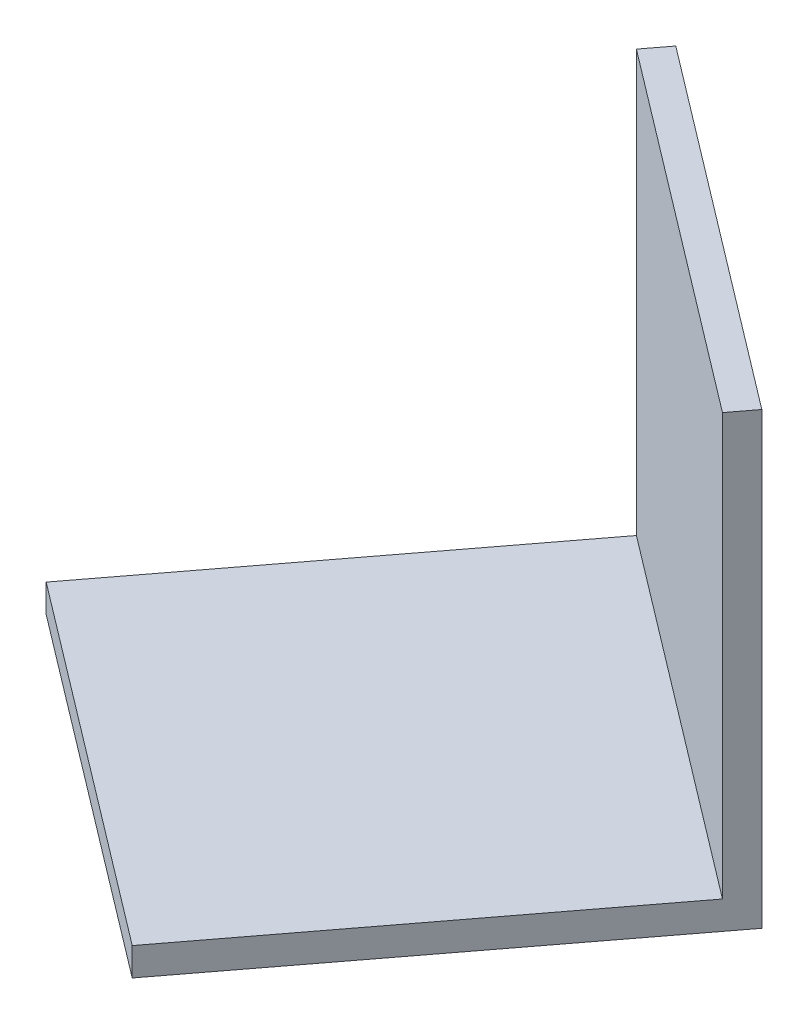
ISO-10303-21;
HEADER;
FILE_DESCRIPTION(('STEP AP214'),'2;1');
FILE_NAME('part.step','',(''),(''),'','','');
FILE_SCHEMA(('AUTOMOTIVE_DESIGN { 1 0 10303 214 1 1 1 1 }'));
ENDSEC;
DATA;
#1=APPLICATION_CONTEXT('core data for automotive mechanical design processes');
#2=APPLICATION_PROTOCOL_DEFINITION('international standard','automotive_design',2000,#1);
#3=PRODUCT_CONTEXT('',#1,'mechanical');
#4=PRODUCT('Part','Part','',(#3));
#5=PRODUCT_RELATED_PRODUCT_CATEGORY('part','',(#4));
#6=PRODUCT_DEFINITION_FORMATION('','',#4);
#7=PRODUCT_DEFINITION_CONTEXT('part definition',#1,'design');
#8=PRODUCT_DEFINITION('design','',#6,#7);
#9=PRODUCT_DEFINITION_SHAPE('','',#8);
#10=(LENGTH_UNIT() NAMED_UNIT(*) SI_UNIT(.MILLI.,.METRE.));
#11=(NAMED_UNIT(*) PLANE_ANGLE_UNIT() SI_UNIT($,.RADIAN.));
#12=(NAMED_UNIT(*) SI_UNIT($,.STERADIAN.) SOLID_ANGLE_UNIT());
#13=UNCERTAINTY_MEASURE_WITH_UNIT(LENGTH_MEASURE(1.E-05),#10,'distance_accuracy_value','');
#14=(GEOMETRIC_REPRESENTATION_CONTEXT(3) GLOBAL_UNCERTAINTY_ASSIGNED_CONTEXT((#13)) GLOBAL_UNIT_ASSIGNED_CONTEXT((#10,
#11,#12)) REPRESENTATION_CONTEXT('',''));
#15=CARTESIAN_POINT('',(0.,0.,0.));
#16=DIRECTION('',(0.,0.,1.));
#17=DIRECTION('',(1.,0.,0.));
#18=AXIS2_PLACEMENT_3D('',#15,#16,#17);
#19=CARTESIAN_POINT('',(0.,1.5875,0.));
#20=DIRECTION('',(0.,-1.,0.));
#21=DIRECTION('',(0.,0.,-1.));
#22=AXIS2_PLACEMENT_3D('',#19,#20,#21);
#23=PLANE('',#22);
#24=DIRECTION('',(0.796356247548099,0.,0.604827849053854));
#25=VECTOR('',#24,1.);
#26=CARTESIAN_POINT('',(-5.82498553212682,1.5875,-34.325860510707));
#27=LINE('',#26,#25);
#28=CARTESIAN_POINT('',(-5.82498553212682,1.5875,-34.325860510707));
#29=VERTEX_POINT('',#28);
#30=CARTESIAN_POINT('',(14.4024631555949,1.5875,-18.9632331447391));
#31=VERTEX_POINT('',#30);
#32=EDGE_CURVE('E50',#29,#31,#27,.T.);
#33=ORIENTED_EDGE('',*,*,#32,.F.);
#34=DIRECTION('',(-0.604827849053854,0.,0.796356247548099));
#35=VECTOR('',#34,1.);
#36=CARTESIAN_POINT('',(-20.2274486877217,1.5875,-15.3626273659679));
#37=LINE('',#36,#35);
#38=CARTESIAN_POINT('',(-20.2274486877217,1.5875,-15.3626273659679));
#39=VERTEX_POINT('',#38);
#40=EDGE_CURVE('E55',#29,#39,#37,.T.);
#41=ORIENTED_EDGE('',*,*,#40,.T.);
#42=DIRECTION('',(0.796356247548099,0.,0.604827849053854));
#43=VECTOR('',#42,1.);
#44=CARTESIAN_POINT('',(0.,1.5875,0.));
#45=LINE('',#44,#43);
#46=CARTESIAN_POINT('',(0.,1.5875,0.));
#47=VERTEX_POINT('',#46);
#48=EDGE_CURVE('E86',#39,#47,#45,.T.);
#49=ORIENTED_EDGE('',*,*,#48,.T.);
#50=DIRECTION('',(0.604827849053854,0.,-0.796356247548099));
#51=VECTOR('',#50,1.);
#52=CARTESIAN_POINT('',(0.,1.5875,0.));
#53=LINE('',#52,#51);
#54=EDGE_CURVE('E136',#47,#31,#53,.T.);
#55=ORIENTED_EDGE('',*,*,#54,.T.);
#56=EDGE_LOOP('',(#33,#41,#49,#55));
#57=FACE_BOUND('',#56,.T.);
#58=ADVANCED_FACE('F35',(#57),#23,.F.);
#59=CARTESIAN_POINT('',(0.,1.5875,0.));
#60=DIRECTION('',(0.604827849053854,0.,-0.796356247548099));
#61=DIRECTION('',(-0.796356247548099,0.,-0.604827849053854));
#62=AXIS2_PLACEMENT_3D('',#59,#60,#61);
#63=PLANE('',#62);
#64=DIRECTION('',(0.796356247548099,0.,0.604827849053854));
#65=VECTOR('',#64,1.);
#66=CARTESIAN_POINT('',(0.,0.,0.));
#67=LINE('',#66,#65);
#68=CARTESIAN_POINT('',(-20.2274486877217,0.,-15.3626273659679));
#69=VERTEX_POINT('',#68);
#70=CARTESIAN_POINT('',(0.,0.,0.));
#71=VERTEX_POINT('',#70);
#72=EDGE_CURVE('E92',#69,#71,#67,.T.);
#73=ORIENTED_EDGE('',*,*,#72,.T.);
#74=DIRECTION('',(0.,-1.,0.));
#75=VECTOR('',#74,1.);
#76=CARTESIAN_POINT('',(0.,1.5875,0.));
#77=LINE('',#76,#75);
#78=EDGE_CURVE('E11',#47,#71,#77,.T.);
#79=ORIENTED_EDGE('',*,*,#78,.F.);
#80=ORIENTED_EDGE('',*,*,#48,.F.);
#81=DIRECTION('',(0.,-1.,0.));
#82=VECTOR('',#81,1.);
#83=CARTESIAN_POINT('',(-20.2274486877217,1.5875,-15.3626273659679));
#84=LINE('',#83,#82);
#85=EDGE_CURVE('E78',#39,#69,#84,.T.);
#86=ORIENTED_EDGE('',*,*,#85,.T.);
#87=EDGE_LOOP('',(#73,#79,#80,#86));
#88=FACE_BOUND('',#87,.T.);
#89=ADVANCED_FACE('F37',(#88),#63,.F.);
#90=CARTESIAN_POINT('',(0.,1.5875,0.));
#91=DIRECTION('',(-0.796356247548099,0.,-0.604827849053854));
#92=DIRECTION('',(-0.604827849053854,0.,0.796356247548099));
#93=AXIS2_PLACEMENT_3D('',#90,#91,#92);
#94=PLANE('',#93);
#95=DIRECTION('',(0.604827849053854,0.,-0.796356247548099));
#96=VECTOR('',#95,1.);
#97=CARTESIAN_POINT('',(0.,0.,0.));
#98=LINE('',#97,#96);
#99=CARTESIAN_POINT('',(15.3626273659679,0.,-20.2274486877217));
#100=VERTEX_POINT('',#99);
#101=EDGE_CURVE('E95',#71,#100,#98,.T.);
#102=ORIENTED_EDGE('',*,*,#101,.T.);
#103=DIRECTION('',(0.,-1.,0.));
#104=VECTOR('',#103,1.);
#105=CARTESIAN_POINT('',(15.3626273659679,1.5875,-20.2274486877217));
#106=LINE('',#105,#104);
#107=CARTESIAN_POINT('',(15.3626273659679,25.4,-20.2274486877217));
#108=VERTEX_POINT('',#107);
#109=EDGE_CURVE('E43',#108,#100,#106,.T.);
#110=ORIENTED_EDGE('',*,*,#109,.F.);
#111=DIRECTION('',(0.604827849053851,0.,-0.796356247548101));
#112=VECTOR('',#111,1.);
#113=CARTESIAN_POINT('',(15.3626273659679,25.4,-20.2274486877217));
#114=LINE('',#113,#112);
#115=CARTESIAN_POINT('',(14.4024631555949,25.4,-18.9632331447391));
#116=VERTEX_POINT('',#115);
#117=EDGE_CURVE('E119',#116,#108,#114,.T.);
#118=ORIENTED_EDGE('',*,*,#117,.F.);
#119=DIRECTION('',(0.,-1.,0.));
#120=VECTOR('',#119,1.);
#121=CARTESIAN_POINT('',(14.4024631555949,25.4,-18.9632331447391));
#122=LINE('',#121,#120);
#123=EDGE_CURVE('E100',#116,#31,#122,.T.);
#124=ORIENTED_EDGE('',*,*,#123,.T.);
#125=ORIENTED_EDGE('',*,*,#54,.F.);
#126=ORIENTED_EDGE('',*,*,#78,.T.);
#127=EDGE_LOOP('',(#102,#110,#118,#124,#125,#126));
#128=FACE_BOUND('',#127,.T.);
#129=ADVANCED_FACE('F116',(#128),#94,.F.);
#130=CARTESIAN_POINT('',(15.3626273659679,1.5875,-20.2274486877217));
#131=DIRECTION('',(-0.604827849053853,0.,0.796356247548099));
#132=DIRECTION('',(0.796356247548099,0.,0.604827849053853));
#133=AXIS2_PLACEMENT_3D('',#130,#131,#132);
#134=PLANE('',#133);
#135=DIRECTION('',(-0.796356247548099,0.,-0.604827849053853));
#136=VECTOR('',#135,1.);
#137=CARTESIAN_POINT('',(15.3626273659679,0.,-20.2274486877217));
#138=LINE('',#137,#136);
#139=CARTESIAN_POINT('',(-4.86482132175382,0.,-35.5900760536896));
#140=VERTEX_POINT('',#139);
#141=EDGE_CURVE('E87',#100,#140,#138,.T.);
#142=ORIENTED_EDGE('',*,*,#141,.T.);
#143=DIRECTION('',(0.,-1.,0.));
#144=VECTOR('',#143,1.);
#145=CARTESIAN_POINT('',(-4.86482132175382,1.5875,-35.5900760536896));
#146=LINE('',#145,#144);
#147=CARTESIAN_POINT('',(-4.86482132175382,25.4,-35.5900760536896));
#148=VERTEX_POINT('',#147);
#149=EDGE_CURVE('E82',#148,#140,#146,.T.);
#150=ORIENTED_EDGE('',*,*,#149,.F.);
#151=DIRECTION('',(-0.796356247548099,0.,-0.604827849053854));
#152=VECTOR('',#151,1.);
#153=CARTESIAN_POINT('',(-4.86482132175382,25.4,-35.5900760536896));
#154=LINE('',#153,#152);
#155=EDGE_CURVE('E112',#108,#148,#154,.T.);
#156=ORIENTED_EDGE('',*,*,#155,.F.);
#157=ORIENTED_EDGE('',*,*,#109,.T.);
#158=EDGE_LOOP('',(#142,#150,#156,#157));
#159=FACE_BOUND('',#158,.T.);
#160=ADVANCED_FACE('F110',(#159),#134,.F.);
#161=CARTESIAN_POINT('',(-20.2274486877217,1.5875,-15.3626273659679));
#162=DIRECTION('',(0.796356247548099,0.,0.604827849053854));
#163=DIRECTION('',(0.604827849053854,0.,-0.796356247548099));
#164=AXIS2_PLACEMENT_3D('',#161,#162,#163);
#165=PLANE('',#164);
#166=DIRECTION('',(-0.604827849053854,0.,0.796356247548099));
#167=VECTOR('',#166,1.);
#168=CARTESIAN_POINT('',(-20.2274486877217,0.,-15.3626273659679));
#169=LINE('',#168,#167);
#170=EDGE_CURVE('E75',#140,#69,#169,.T.);
#171=ORIENTED_EDGE('',*,*,#170,.T.);
#172=ORIENTED_EDGE('',*,*,#85,.F.);
#173=ORIENTED_EDGE('',*,*,#40,.F.);
#174=DIRECTION('',(0.,-1.,0.));
#175=VECTOR('',#174,1.);
#176=CARTESIAN_POINT('',(-5.82498553212682,25.4,-34.325860510707));
#177=LINE('',#176,#175);
#178=CARTESIAN_POINT('',(-5.82498553212682,25.4,-34.325860510707));
#179=VERTEX_POINT('',#178);
#180=EDGE_CURVE('E96',#179,#29,#177,.T.);
#181=ORIENTED_EDGE('',*,*,#180,.F.);
#182=DIRECTION('',(-0.604827849053853,0.,0.796356247548099));
#183=VECTOR('',#182,1.);
#184=CARTESIAN_POINT('',(-4.86482132175382,25.4,-35.5900760536896));
#185=LINE('',#184,#183);
#186=EDGE_CURVE('E131',#148,#179,#185,.T.);
#187=ORIENTED_EDGE('',*,*,#186,.F.);
#188=ORIENTED_EDGE('',*,*,#149,.T.);
#189=EDGE_LOOP('',(#171,#172,#173,#181,#187,#188));
#190=FACE_BOUND('',#189,.T.);
#191=ADVANCED_FACE('F77',(#190),#165,.F.);
#192=CARTESIAN_POINT('',(0.,0.,0.));
#193=DIRECTION('',(0.,-1.,0.));
#194=DIRECTION('',(0.,0.,-1.));
#195=AXIS2_PLACEMENT_3D('',#192,#193,#194);
#196=PLANE('',#195);
#197=ORIENTED_EDGE('',*,*,#72,.F.);
#198=ORIENTED_EDGE('',*,*,#170,.F.);
#199=ORIENTED_EDGE('',*,*,#141,.F.);
#200=ORIENTED_EDGE('',*,*,#101,.F.);
#201=EDGE_LOOP('',(#197,#198,#199,#200));
#202=FACE_BOUND('',#201,.T.);
#203=ADVANCED_FACE('F94',(#202),#196,.T.);
#204=CARTESIAN_POINT('',(-5.82498553212682,25.4,-34.325860510707));
#205=DIRECTION('',(0.604827849053854,0.,-0.796356247548099));
#206=DIRECTION('',(-0.796356247548099,0.,-0.604827849053854));
#207=AXIS2_PLACEMENT_3D('',#204,#205,#206);
#208=PLANE('',#207);
#209=ORIENTED_EDGE('',*,*,#32,.T.);
#210=ORIENTED_EDGE('',*,*,#123,.F.);
#211=DIRECTION('',(0.796356247548099,0.,0.604827849053854));
#212=VECTOR('',#211,1.);
#213=CARTESIAN_POINT('',(-5.82498553212682,25.4,-34.325860510707));
#214=LINE('',#213,#212);
#215=EDGE_CURVE('E127',#179,#116,#214,.T.);
#216=ORIENTED_EDGE('',*,*,#215,.F.);
#217=ORIENTED_EDGE('',*,*,#180,.T.);
#218=EDGE_LOOP('',(#209,#210,#216,#217));
#219=FACE_BOUND('',#218,.T.);
#220=ADVANCED_FACE('F139',(#219),#208,.F.);
#221=CARTESIAN_POINT('',(0.,25.4,0.));
#222=DIRECTION('',(0.,-1.,0.));
#223=DIRECTION('',(0.,0.,-1.));
#224=AXIS2_PLACEMENT_3D('',#221,#222,#223);
#225=PLANE('',#224);
#226=ORIENTED_EDGE('',*,*,#155,.T.);
#227=ORIENTED_EDGE('',*,*,#186,.T.);
#228=ORIENTED_EDGE('',*,*,#215,.T.);
#229=ORIENTED_EDGE('',*,*,#117,.T.);
#230=EDGE_LOOP('',(#226,#227,#228,#229));
#231=FACE_BOUND('',#230,.T.);
#232=ADVANCED_FACE('F123',(#231),#225,.F.);
#233=CLOSED_SHELL('',(#58,#89,#129,#160,#191,#203,#220,#232));
#234=MANIFOLD_SOLID_BREP('B2',#233);
#235=ADVANCED_BREP_SHAPE_REPRESENTATION('',(#18,#234),#14);
#236=SHAPE_DEFINITION_REPRESENTATION(#9,#235);
ENDSEC;
END-ISO-10303-21;
